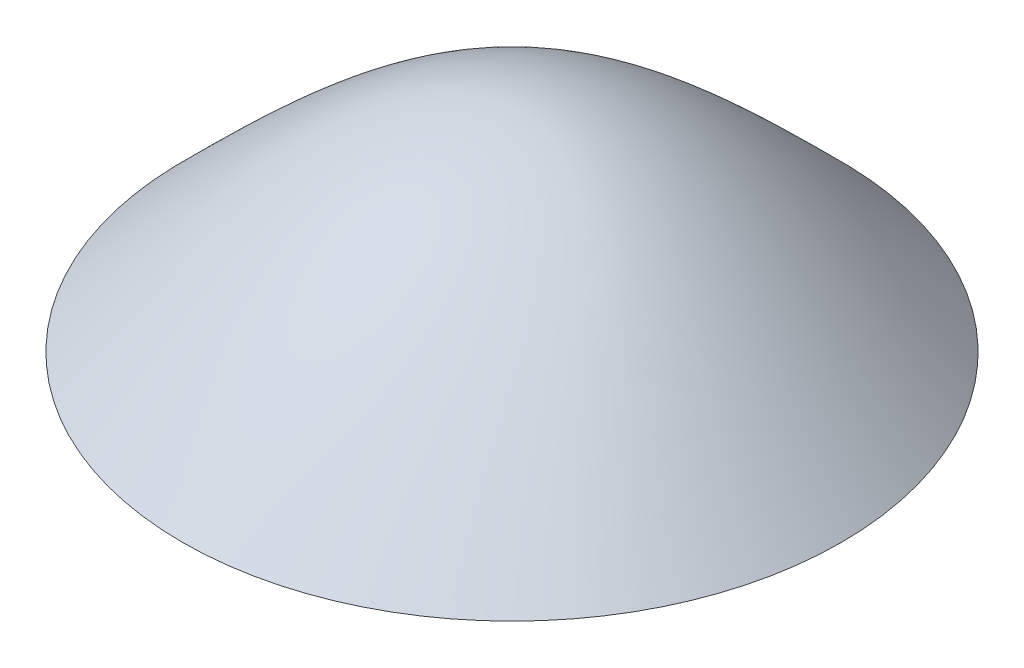
ISO-10303-21;
HEADER;
FILE_DESCRIPTION(('STEP AP214'),'2;1');
FILE_NAME('part.step','',(''),(''),'','','');
FILE_SCHEMA(('AUTOMOTIVE_DESIGN { 1 0 10303 214 1 1 1 1 }'));
ENDSEC;
DATA;
#1=APPLICATION_CONTEXT('core data for automotive mechanical design processes');
#2=APPLICATION_PROTOCOL_DEFINITION('international standard','automotive_design',2000,#1);
#3=PRODUCT_CONTEXT('',#1,'mechanical');
#4=PRODUCT('Part','Part','',(#3));
#5=PRODUCT_RELATED_PRODUCT_CATEGORY('part','',(#4));
#6=PRODUCT_DEFINITION_FORMATION('','',#4);
#7=PRODUCT_DEFINITION_CONTEXT('part definition',#1,'design');
#8=PRODUCT_DEFINITION('design','',#6,#7);
#9=PRODUCT_DEFINITION_SHAPE('','',#8);
#10=(LENGTH_UNIT() NAMED_UNIT(*) SI_UNIT(.MILLI.,.METRE.));
#11=(NAMED_UNIT(*) PLANE_ANGLE_UNIT() SI_UNIT($,.RADIAN.));
#12=(NAMED_UNIT(*) SI_UNIT($,.STERADIAN.) SOLID_ANGLE_UNIT());
#13=UNCERTAINTY_MEASURE_WITH_UNIT(LENGTH_MEASURE(1.E-05),#10,'distance_accuracy_value','');
#14=(GEOMETRIC_REPRESENTATION_CONTEXT(3) GLOBAL_UNCERTAINTY_ASSIGNED_CONTEXT((#13)) GLOBAL_UNIT_ASSIGNED_CONTEXT((#10,
#11,#12)) REPRESENTATION_CONTEXT('',''));
#15=CARTESIAN_POINT('',(0.,0.,0.));
#16=DIRECTION('',(0.,0.,1.));
#17=DIRECTION('',(1.,0.,0.));
#18=AXIS2_PLACEMENT_3D('',#15,#16,#17);
#19=CARTESIAN_POINT('',(1.56,0.010796117,0.));
#20=CARTESIAN_POINT('',(1.55333370765861,0.0174616054395173,0.));
#21=CARTESIAN_POINT('',(1.54000317521096,0.0307905303309138,0.));
#22=CARTESIAN_POINT('',(1.5200050511005,0.0507727729919464,0.));
#23=CARTESIAN_POINT('',(1.50000708037222,0.0707348684672266,0.));
#24=CARTESIAN_POINT('',(1.48000906392536,0.090668636753071,0.));
#25=CARTESIAN_POINT('',(1.46001105651352,0.110566162382752,0.));
#26=CARTESIAN_POINT('',(1.44001304066158,0.130419472667024,0.));
#27=CARTESIAN_POINT('',(1.4200150201994,0.150220633257745,0.));
#28=CARTESIAN_POINT('',(1.40001699355636,0.169961725776834,0.));
#29=CARTESIAN_POINT('',(1.38001895896549,0.189634855993793,0.));
#30=CARTESIAN_POINT('',(1.36002091694242,0.209232158713434,0.));
#31=CARTESIAN_POINT('',(1.3400228649865,0.228745796379501,0.));
#32=CARTESIAN_POINT('',(1.32002480292765,0.24816796686345,0.));
#33=CARTESIAN_POINT('',(1.30002672913292,0.267490903593865,0.));
#34=CARTESIAN_POINT('',(1.28002864297505,0.286706880432753,0.));
#35=CARTESIAN_POINT('',(1.26003054204832,0.305808212783541,0.));
#36=CARTESIAN_POINT('',(1.24003242646489,0.324787264417756,0.));
#37=CARTESIAN_POINT('',(1.22003429408139,0.343636445826171,0.));
#38=CARTESIAN_POINT('',(1.20003614311243,0.362348219598628,0.));
#39=CARTESIAN_POINT('',(1.18003797272006,0.380915104428133,0.));
#40=CARTESIAN_POINT('',(1.16003978035193,0.399329675579752,0.));
#41=CARTESIAN_POINT('',(1.14004156542707,0.417584570883238,0.));
#42=CARTESIAN_POINT('',(1.12004332453805,0.43567248950116,0.));
#43=CARTESIAN_POINT('',(1.10004505678066,0.453586200098888,0.));
#44=CARTESIAN_POINT('',(1.08004675980117,0.471318539854129,0.));
#45=CARTESIAN_POINT('',(1.06004843145715,0.488862418276832,0.));
#46=CARTESIAN_POINT('',(1.04005006857223,0.506210819447669,0.));
#47=CARTESIAN_POINT('',(1.02005166955677,0.523356807702558,0.));
#48=CARTESIAN_POINT('',(1.00005323157162,0.540293527057652,0.));
#49=CARTESIAN_POINT('',(0.980054751460454,0.557014204567065,0.));
#50=CARTESIAN_POINT('',(0.960056226138037,0.573512154113816,0.));
#51=CARTESIAN_POINT('',(0.940057652871572,0.589780779436886,0.));
#52=CARTESIAN_POINT('',(0.920059028701831,0.605813575461017,0.));
#53=CARTESIAN_POINT('',(0.90006034853489,0.621604129139473,0.));
#54=CARTESIAN_POINT('',(0.880061610718681,0.637146128511848,0.));
#55=CARTESIAN_POINT('',(0.8600628099643,0.652433357055926,0.));
#56=CARTESIAN_POINT('',(0.840063943354684,0.667459702348159,0.));
#57=CARTESIAN_POINT('',(0.820065005351353,0.682219153513375,0.));
#58=CARTESIAN_POINT('',(0.800065992774582,0.696705809494518,0.));
#59=CARTESIAN_POINT('',(0.780066900742915,0.710913876280152,0.));
#60=CARTESIAN_POINT('',(0.760067724392768,0.724837670786872,0.));
#61=CARTESIAN_POINT('',(0.740068458969934,0.738471623664751,0.));
#62=CARTESIAN_POINT('',(0.720069099233901,0.751810281053743,0.));
#63=CARTESIAN_POINT('',(0.700069640246915,0.764848307680928,0.));
#64=CARTESIAN_POINT('',(0.680070077647792,0.777580488717773,0.));
#65=CARTESIAN_POINT('',(0.660070403724344,0.790001726672006,0.));
#66=CARTESIAN_POINT('',(0.640070616061456,0.802107055865646,0.));
#67=CARTESIAN_POINT('',(0.620070707157923,0.81389162901167,0.));
#68=CARTESIAN_POINT('',(0.600070672087658,0.825350730078689,0.));
#69=CARTESIAN_POINT('',(0.580070505862241,0.836479773119648,0.));
#70=CARTESIAN_POINT('',(0.560070202925175,0.847274302494149,0.));
#71=CARTESIAN_POINT('',(0.54006975763549,0.857729995444912,0.));
#72=CARTESIAN_POINT('',(0.520069166466271,0.867842667427766,0.));
#73=CARTESIAN_POINT('',(0.50006842281148,0.877608264394074,0.));
#74=CARTESIAN_POINT('',(0.480067523619779,0.88702287641625,0.));
#75=CARTESIAN_POINT('',(0.46006646466602,0.896082730650663,0.));
#76=CARTESIAN_POINT('',(0.440065241504841,0.904784193896342,0.));
#77=CARTESIAN_POINT('',(0.420063852251212,0.913123780349355,0.));
#78=CARTESIAN_POINT('',(0.40006229391788,0.921098144770285,0.));
#79=CARTESIAN_POINT('',(0.380060564982216,0.92870408854419,0.));
#80=CARTESIAN_POINT('',(0.360058663980764,0.935938558308375,0.));
#81=CARTESIAN_POINT('',(0.340056591584329,0.942798652230495,0.));
#82=CARTESIAN_POINT('',(0.320054347640757,0.949281613423531,0.));
#83=CARTESIAN_POINT('',(0.300051934855161,0.955384840687058,0.));
#84=CARTESIAN_POINT('',(0.280049355348833,0.961105879928316,0.));
#85=CARTESIAN_POINT('',(0.260046613435173,0.966442432817329,0.));
#86=CARTESIAN_POINT('',(0.240043714126779,0.971392353477273,0.));
#87=CARTESIAN_POINT('',(0.220040663111082,0.975953648848218,0.));
#88=CARTESIAN_POINT('',(0.200037468639442,0.98012448705831,0.));
#89=CARTESIAN_POINT('',(0.180034138577636,0.983903187416993,0.));
#90=CARTESIAN_POINT('',(0.160030682675393,0.987288224596694,0.));
#91=CARTESIAN_POINT('',(0.14002711205856,0.990278251252289,0.));
#92=CARTESIAN_POINT('',(0.120023438350688,0.992872010808114,0.));
#93=CARTESIAN_POINT('',(0.100019674170388,0.995068645871749,0.));
#94=CARTESIAN_POINT('',(0.0800158334323174,0.996866567655131,0.));
#95=CARTESIAN_POINT('',(0.0600119304208966,0.998267677672607,0.));
#96=CARTESIAN_POINT('',(0.0400079801257177,0.999261626326383,0.));
#97=CARTESIAN_POINT('',(0.020003998045811,0.999884476462042,0.));
#98=CARTESIAN_POINT('',(0.00666711099242104,0.999961497284291,0.));
#99=CARTESIAN_POINT('',(0.,1.,0.));
#100=B_SPLINE_CURVE_WITH_KNOTS('',3,(#19,#20,#21,#22,#23,#24,#25,#26,#27,#28,#29,#30,#31,#32,
#33,#34,#35,#36,#37,#38,#39,#40,#41,#42,#43,#44,#45,#46,#47,#48,#49,#50,#51,#52,#53,#54,#55,#56,
#57,#58,#59,#60,#61,#62,#63,#64,#65,#66,#67,#68,#69,#70,#71,#72,#73,#74,#75,#76,#77,#78,#79,#80,
#81,#82,#83,#84,#85,#86,#87,#88,#89,#90,#91,#92,#93,#94,#95,#96,#97,#98,#99),.UNSPECIFIED.,.F.,
.F.,(4,1,1,1,1,1,1,1,1,1,1,1,1,1,1,1,1,1,1,1,1,1,1,1,1,1,1,1,1,1,1,1,1,1,1,1,1,1,1,1,1,1,1,1,1,
1,1,1,1,1,1,1,1,1,1,1,1,1,1,1,1,1,1,1,1,1,1,1,1,1,1,1,1,1,1,1,1,1,4),(0.,0.014925410641296,
0.0298462264568105,0.0447594685312702,0.0596621651172081,0.0745513564171645,0.0894240945295451,
0.10427744898968,0.119108508968061,0.133914385855549,0.14869221734354,0.163439168928597,
0.17815243839218,0.192829258081706,0.207466898318487,0.222062670093667,0.236613929246814,
0.251118078116779,0.265572569408438,0.279974909714638,0.294322661986255,0.30861344947069,
0.322844957893545,0.337014940162907,0.351121218615758,0.365161688368456,0.3791343206985,
0.393037167143795,0.406868361901636,0.420626125306824,0.434308767672254,0.447914692806373,
0.461442400889684,0.474890491723901,0.488257669628908,0.501542745076325,0.514744639276375,
0.527862386826575,0.540895140257746,0.553842172358816,0.566702879750802,0.579476786415029,
0.592163546868178,0.604762949571893,0.617274919682523,0.629699521459146,0.64203696307696,
0.654287596844262,0.666451923445117,0.678530594046731,0.690524411980466,0.702434334985311,
0.714261477160249,0.726007109200681,0.737672660946396,0.749259720969286,0.760770036989512,
0.772205516469708,0.783568225062344,0.794860385866425,0.806084377746325,0.817242733458474,
0.828338136315049,0.839373417459956,0.85035155119222,0.861275650781603,0.872148962862848,
0.88297486149565,0.893756841885213,0.904498512416481,0.915203587214543,0.925875877568919,
0.93651928248489,0.947137779162013,0.957735412949468,0.968316286506874,0.978884548866915,
0.989444384150832,1.),.UNSPECIFIED.);
#101=CARTESIAN_POINT('',(0.,1.,0.));
#102=DIRECTION('',(0.,1.,0.));
#103=AXIS1_PLACEMENT('',#101,#102);
#104=SURFACE_OF_REVOLUTION('',#100,#103);
#105=CARTESIAN_POINT('',(0.,1.,0.));
#106=VERTEX_POINT('',#105);
#107=VERTEX_LOOP('',#106);
#108=FACE_BOUND('',#107,.T.);
#109=CARTESIAN_POINT('',(0.,0.0107961169999999,0.));
#110=DIRECTION('',(0.,1.,0.));
#111=DIRECTION('',(0.,0.,1.));
#112=AXIS2_PLACEMENT_3D('',#109,#110,#111);
#113=CIRCLE('',#112,1.56);
#114=CARTESIAN_POINT('',(0.,0.0107961169999999,1.56));
#115=VERTEX_POINT('',#114);
#116=EDGE_CURVE('E11',#115,#115,#113,.T.);
#117=ORIENTED_EDGE('',*,*,#116,.T.);
#118=EDGE_LOOP('',(#117));
#119=FACE_BOUND('',#118,.T.);
#120=ADVANCED_FACE('F35',(#108,#119),#104,.T.);
#121=CARTESIAN_POINT('',(0.,0.,0.));
#122=DIRECTION('',(0.,1.,0.));
#123=DIRECTION('',(0.,0.,1.));
#124=AXIS2_PLACEMENT_3D('',#121,#122,#123);
#125=CONICAL_SURFACE('',#124,0.,1.56387584945732);
#126=CARTESIAN_POINT('',(0.,0.00283535773887034,0.));
#127=DIRECTION('',(0.,-1.,0.));
#128=DIRECTION('',(0.,0.,-1.));
#129=AXIS2_PLACEMENT_3D('',#126,#127,#128);
#130=CIRCLE('',#129,0.409698975348059);
#131=CARTESIAN_POINT('',(0.,0.00283535773887034,0.409698975348059));
#132=VERTEX_POINT('',#131);
#133=EDGE_CURVE('E39',#132,#132,#130,.F.);
#134=CARTESIAN_POINT('',(0.,0.00283535773887034,0.409698975348059));
#135=CARTESIAN_POINT('',(0.,0.00291828231450711,0.421681277688183));
#136=CARTESIAN_POINT('',(0.,0.00300120689014387,0.433663580028308));
#137=CARTESIAN_POINT('',(0.,0.00316705604141741,0.457628184708556));
#138=CARTESIAN_POINT('',(0.,0.00324998061705417,0.469610487048681));
#139=CARTESIAN_POINT('',(0.,0.00341582976832771,0.49357509172893));
#140=CARTESIAN_POINT('',(0.,0.00349875434396447,0.505557394069054));
#141=CARTESIAN_POINT('',(0.,0.00366460349523801,0.529521998749303));
#142=CARTESIAN_POINT('',(0.,0.00374752807087477,0.541504301089427));
#143=CARTESIAN_POINT('',(0.,0.00391337722214831,0.565468905769676));
#144=CARTESIAN_POINT('',(0.,0.00399630179778507,0.577451208109801));
#145=CARTESIAN_POINT('',(0.,0.00416215094905861,0.601415812790049));
#146=CARTESIAN_POINT('',(0.,0.00424507552469537,0.613398115130174));
#147=CARTESIAN_POINT('',(0.,0.00441092467596891,0.637362719810423));
#148=CARTESIAN_POINT('',(0.,0.00449384925160567,0.649345022150547));
#149=CARTESIAN_POINT('',(0.,0.00465969840287921,0.673309626830796));
#150=CARTESIAN_POINT('',(0.,0.00474262297851598,0.68529192917092));
#151=CARTESIAN_POINT('',(0.,0.00490847212978951,0.709256533851169));
#152=CARTESIAN_POINT('',(0.,0.00499139670542628,0.721238836191293));
#153=CARTESIAN_POINT('',(0.,0.00515724585669981,0.745203440871542));
#154=CARTESIAN_POINT('',(0.,0.00524017043233658,0.757185743211667));
#155=CARTESIAN_POINT('',(0.,0.00540601958361011,0.781150347891916));
#156=CARTESIAN_POINT('',(0.,0.00548894415924688,0.79313265023204));
#157=CARTESIAN_POINT('',(0.,0.00565479331052041,0.817097254912289));
#158=CARTESIAN_POINT('',(0.,0.00573771788615718,0.829079557252413));
#159=CARTESIAN_POINT('',(0.,0.00590356703743071,0.853044161932662));
#160=CARTESIAN_POINT('',(0.,0.00598649161306748,0.865026464272786));
#161=CARTESIAN_POINT('',(0.,0.00615234076434101,0.888991068953035));
#162=CARTESIAN_POINT('',(0.,0.00623526533997778,0.90097337129316));
#163=CARTESIAN_POINT('',(0.,0.00640111449125131,0.924937975973409));
#164=CARTESIAN_POINT('',(0.,0.00648403906688808,0.936920278313533));
#165=CARTESIAN_POINT('',(0.,0.00664988821816161,0.960884882993782));
#166=CARTESIAN_POINT('',(0.,0.00673281279379838,0.972867185333906));
#167=CARTESIAN_POINT('',(0.,0.00689866194507191,0.996831790014155));
#168=CARTESIAN_POINT('',(0.,0.00698158652070868,1.00881409235428));
#169=CARTESIAN_POINT('',(0.,0.00714743567198221,1.03277869703453));
#170=CARTESIAN_POINT('',(0.,0.00723036024761898,1.04476099937465));
#171=CARTESIAN_POINT('',(0.,0.00739620939889251,1.0687256040549));
#172=CARTESIAN_POINT('',(0.,0.00747913397452928,1.08070790639503));
#173=CARTESIAN_POINT('',(0.,0.00764498312580281,1.10467251107527));
#174=CARTESIAN_POINT('',(0.,0.00772790770143958,1.1166548134154));
#175=CARTESIAN_POINT('',(0.,0.00789375685271311,1.14061941809565));
#176=CARTESIAN_POINT('',(0.,0.00797668142834988,1.15260172043577));
#177=CARTESIAN_POINT('',(0.,0.00814253057962341,1.17656632511602));
#178=CARTESIAN_POINT('',(0.,0.00822545515526018,1.18854862745615));
#179=CARTESIAN_POINT('',(0.,0.00839130430653371,1.21251323213639));
#180=CARTESIAN_POINT('',(0.,0.00847422888217048,1.22449553447652));
#181=CARTESIAN_POINT('',(0.,0.00864007803344401,1.24846013915677));
#182=CARTESIAN_POINT('',(0.,0.00872300260908078,1.26044244149689));
#183=CARTESIAN_POINT('',(0.,0.00888885176035431,1.28440704617714));
#184=CARTESIAN_POINT('',(0.,0.00897177633599108,1.29638934851727));
#185=CARTESIAN_POINT('',(0.,0.00913762548726461,1.32035395319751));
#186=CARTESIAN_POINT('',(0.,0.00922055006290138,1.33233625553764));
#187=CARTESIAN_POINT('',(0.,0.00938639921417491,1.35630086021789));
#188=CARTESIAN_POINT('',(0.,0.00946932378981168,1.36828316255801));
#189=CARTESIAN_POINT('',(0.,0.00963517294108521,1.39224776723826));
#190=CARTESIAN_POINT('',(0.,0.00971809751672198,1.40423006957838));
#191=CARTESIAN_POINT('',(0.,0.00988394666799551,1.42819467425863));
#192=CARTESIAN_POINT('',(0.,0.00996687124363228,1.44017697659876));
#193=CARTESIAN_POINT('',(0.,0.0101327203949058,1.46414158127901));
#194=CARTESIAN_POINT('',(0.,0.0102156449705426,1.47612388361913));
#195=CARTESIAN_POINT('',(0.,0.0103814941218161,1.50008848829938));
#196=CARTESIAN_POINT('',(0.,0.0104644186974529,1.5120707906395));
#197=CARTESIAN_POINT('',(0.,0.0106302678487264,1.53603539531975));
#198=CARTESIAN_POINT('',(0.,0.0107131924243632,1.54801769765988));
#199=CARTESIAN_POINT('',(0.,0.0107961169999999,1.56));
#200=B_SPLINE_CURVE_WITH_KNOTS('',3,(#134,#135,#136,#137,#138,#139,#140,#141,#142,#143,#144,
#145,#146,#147,#148,#149,#150,#151,#152,#153,#154,#155,#156,#157,#158,#159,#160,#161,#162,#163,
#164,#165,#166,#167,#168,#169,#170,#171,#172,#173,#174,#175,#176,#177,#178,#179,#180,#181,#182,
#183,#184,#185,#186,#187,#188,#189,#190,#191,#192,#193,#194,#195,#196,#197,#198,#199),
.UNSPECIFIED.,.F.,.F.,(4,2,2,2,2,2,2,2,2,2,2,2,2,2,2,2,2,2,2,2,2,2,2,2,2,2,2,2,2,2,2,2,4),(0.,
0.0359477678402785,0.0718955356805569,0.107843303520835,0.143791071361114,0.179738839201392,
0.215686607041671,0.251634374881949,0.287582142722228,0.323529910562506,0.359477678402785,
0.395425446243063,0.431373214083342,0.46732098192362,0.503268749763899,0.539216517604177,
0.575164285444456,0.611112053284734,0.647059821125013,0.683007588965291,0.71895535680557,
0.754903124645848,0.790850892486127,0.826798660326405,0.862746428166684,0.898694196006962,
0.934641963847241,0.970589731687519,1.0065374995278,1.04248526736808,1.07843303520835,
1.11438080304863,1.15032857088891),.UNSPECIFIED.);
#201=EDGE_CURVE('BSEAM47',#132,#115,#200,.T.);
#202=ORIENTED_EDGE('',*,*,#133,.T.);
#203=ORIENTED_EDGE('',*,*,#116,.F.);
#204=ORIENTED_EDGE('',*,*,#201,.T.);
#205=ORIENTED_EDGE('',*,*,#201,.F.);
#206=EDGE_LOOP('',(#202,#204,#203,#205));
#207=FACE_BOUND('',#206,.T.);
#208=ADVANCED_FACE('F47',(#207),#125,.T.);
#209=CARTESIAN_POINT('',(0.,0.,0.));
#210=DIRECTION('',(0.,0.,1.));
#211=DIRECTION('',(-1.,0.,0.));
#212=AXIS2_PLACEMENT_3D('',#209,#210,#211);
#213=SPHERICAL_SURFACE('',#212,0.409708786401703);
#214=CARTESIAN_POINT('',(0.,0.,0.));
#215=DIRECTION('',(0.,-1.,0.));
#216=DIRECTION('',(0.,0.,-1.));
#217=AXIS2_PLACEMENT_3D('',#214,#215,#216);
#218=SPHERICAL_SURFACE('',#217,0.409708786401703);
#219=ORIENTED_EDGE('',*,*,#133,.F.);
#220=EDGE_LOOP('',(#219));
#221=FACE_BOUND('',#220,.T.);
#222=ADVANCED_FACE('F51',(#221),#218,.F.);
#223=CLOSED_SHELL('',(#120,#208,#222));
#224=MANIFOLD_SOLID_BREP('B2',#223);
#225=ADVANCED_BREP_SHAPE_REPRESENTATION('',(#18,#224),#14);
#226=SHAPE_DEFINITION_REPRESENTATION(#9,#225);
ENDSEC;
END-ISO-10303-21;
